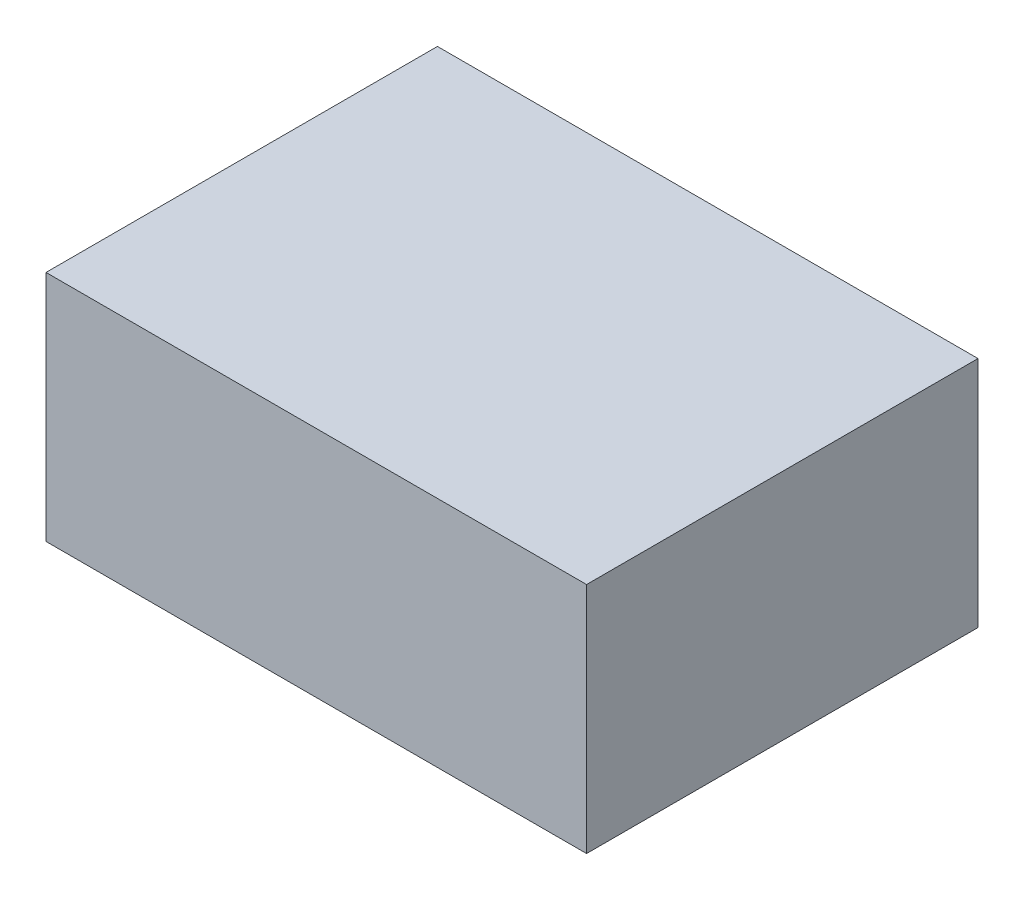
ISO-10303-21;
HEADER;
FILE_DESCRIPTION(('STEP AP214'),'2;1');
FILE_NAME('part.step','',(''),(''),'','','');
FILE_SCHEMA(('AUTOMOTIVE_DESIGN { 1 0 10303 214 1 1 1 1 }'));
ENDSEC;
DATA;
#1=APPLICATION_CONTEXT('core data for automotive mechanical design processes');
#2=APPLICATION_PROTOCOL_DEFINITION('international standard','automotive_design',2000,#1);
#3=PRODUCT_CONTEXT('',#1,'mechanical');
#4=PRODUCT('Part','Part','',(#3));
#5=PRODUCT_RELATED_PRODUCT_CATEGORY('part','',(#4));
#6=PRODUCT_DEFINITION_FORMATION('','',#4);
#7=PRODUCT_DEFINITION_CONTEXT('part definition',#1,'design');
#8=PRODUCT_DEFINITION('design','',#6,#7);
#9=PRODUCT_DEFINITION_SHAPE('','',#8);
#10=(LENGTH_UNIT() NAMED_UNIT(*) SI_UNIT(.MILLI.,.METRE.));
#11=(NAMED_UNIT(*) PLANE_ANGLE_UNIT() SI_UNIT($,.RADIAN.));
#12=(NAMED_UNIT(*) SI_UNIT($,.STERADIAN.) SOLID_ANGLE_UNIT());
#13=UNCERTAINTY_MEASURE_WITH_UNIT(LENGTH_MEASURE(1.E-05),#10,'distance_accuracy_value','');
#14=(GEOMETRIC_REPRESENTATION_CONTEXT(3) GLOBAL_UNCERTAINTY_ASSIGNED_CONTEXT((#13)) GLOBAL_UNIT_ASSIGNED_CONTEXT((#10,
#11,#12)) REPRESENTATION_CONTEXT('',''));
#15=CARTESIAN_POINT('',(0.,0.,0.));
#16=DIRECTION('',(0.,0.,1.));
#17=DIRECTION('',(1.,0.,0.));
#18=AXIS2_PLACEMENT_3D('',#15,#16,#17);
#19=CARTESIAN_POINT('',(0.,0.,21.));
#20=DIRECTION('',(1.,0.,0.));
#21=DIRECTION('',(0.,0.,-1.));
#22=AXIS2_PLACEMENT_3D('',#19,#20,#21);
#23=PLANE('',#22);
#24=DIRECTION('',(0.,-1.,0.));
#25=VECTOR('',#24,1.);
#26=CARTESIAN_POINT('',(0.,0.,0.));
#27=LINE('',#26,#25);
#28=CARTESIAN_POINT('',(0.,12.5,0.));
#29=VERTEX_POINT('',#28);
#30=CARTESIAN_POINT('',(0.,0.,0.));
#31=VERTEX_POINT('',#30);
#32=EDGE_CURVE('E96',#29,#31,#27,.T.);
#33=ORIENTED_EDGE('',*,*,#32,.T.);
#34=DIRECTION('',(0.,0.,-1.));
#35=VECTOR('',#34,1.);
#36=CARTESIAN_POINT('',(0.,0.,21.));
#37=LINE('',#36,#35);
#38=CARTESIAN_POINT('',(0.,0.,21.));
#39=VERTEX_POINT('',#38);
#40=EDGE_CURVE('E11',#39,#31,#37,.T.);
#41=ORIENTED_EDGE('',*,*,#40,.F.);
#42=DIRECTION('',(0.,-1.,0.));
#43=VECTOR('',#42,1.);
#44=CARTESIAN_POINT('',(0.,0.,21.));
#45=LINE('',#44,#43);
#46=CARTESIAN_POINT('',(0.,12.5,21.));
#47=VERTEX_POINT('',#46);
#48=EDGE_CURVE('E84',#47,#39,#45,.T.);
#49=ORIENTED_EDGE('',*,*,#48,.F.);
#50=DIRECTION('',(0.,0.,-1.));
#51=VECTOR('',#50,1.);
#52=CARTESIAN_POINT('',(0.,12.5,21.));
#53=LINE('',#52,#51);
#54=EDGE_CURVE('E92',#47,#29,#53,.T.);
#55=ORIENTED_EDGE('',*,*,#54,.T.);
#56=EDGE_LOOP('',(#33,#41,#49,#55));
#57=FACE_BOUND('',#56,.T.);
#58=ADVANCED_FACE('F33',(#57),#23,.F.);
#59=CARTESIAN_POINT('',(0.,0.,21.));
#60=DIRECTION('',(0.,1.,0.));
#61=DIRECTION('',(0.,0.,1.));
#62=AXIS2_PLACEMENT_3D('',#59,#60,#61);
#63=PLANE('',#62);
#64=DIRECTION('',(1.,0.,0.));
#65=VECTOR('',#64,1.);
#66=CARTESIAN_POINT('',(0.,0.,0.));
#67=LINE('',#66,#65);
#68=CARTESIAN_POINT('',(29.,0.,0.));
#69=VERTEX_POINT('',#68);
#70=EDGE_CURVE('E88',#31,#69,#67,.T.);
#71=ORIENTED_EDGE('',*,*,#70,.T.);
#72=DIRECTION('',(0.,0.,-1.));
#73=VECTOR('',#72,1.);
#74=CARTESIAN_POINT('',(29.,0.,21.));
#75=LINE('',#74,#73);
#76=CARTESIAN_POINT('',(29.,0.,21.));
#77=VERTEX_POINT('',#76);
#78=EDGE_CURVE('E41',#77,#69,#75,.T.);
#79=ORIENTED_EDGE('',*,*,#78,.F.);
#80=DIRECTION('',(1.,0.,0.));
#81=VECTOR('',#80,1.);
#82=CARTESIAN_POINT('',(0.,0.,21.));
#83=LINE('',#82,#81);
#84=EDGE_CURVE('E79',#39,#77,#83,.T.);
#85=ORIENTED_EDGE('',*,*,#84,.F.);
#86=ORIENTED_EDGE('',*,*,#40,.T.);
#87=EDGE_LOOP('',(#71,#79,#85,#86));
#88=FACE_BOUND('',#87,.T.);
#89=ADVANCED_FACE('F87',(#88),#63,.F.);
#90=CARTESIAN_POINT('',(29.,0.,21.));
#91=DIRECTION('',(-1.,0.,0.));
#92=DIRECTION('',(0.,0.,1.));
#93=AXIS2_PLACEMENT_3D('',#90,#91,#92);
#94=PLANE('',#93);
#95=DIRECTION('',(0.,1.,0.));
#96=VECTOR('',#95,1.);
#97=CARTESIAN_POINT('',(29.,0.,0.));
#98=LINE('',#97,#96);
#99=CARTESIAN_POINT('',(29.,12.5,0.));
#100=VERTEX_POINT('',#99);
#101=EDGE_CURVE('E66',#69,#100,#98,.T.);
#102=ORIENTED_EDGE('',*,*,#101,.T.);
#103=DIRECTION('',(0.,0.,-1.));
#104=VECTOR('',#103,1.);
#105=CARTESIAN_POINT('',(29.,12.5,21.));
#106=LINE('',#105,#104);
#107=CARTESIAN_POINT('',(29.,12.5,21.));
#108=VERTEX_POINT('',#107);
#109=EDGE_CURVE('E89',#108,#100,#106,.T.);
#110=ORIENTED_EDGE('',*,*,#109,.F.);
#111=DIRECTION('',(0.,1.,0.));
#112=VECTOR('',#111,1.);
#113=CARTESIAN_POINT('',(29.,0.,21.));
#114=LINE('',#113,#112);
#115=EDGE_CURVE('E82',#77,#108,#114,.T.);
#116=ORIENTED_EDGE('',*,*,#115,.F.);
#117=ORIENTED_EDGE('',*,*,#78,.T.);
#118=EDGE_LOOP('',(#102,#110,#116,#117));
#119=FACE_BOUND('',#118,.T.);
#120=ADVANCED_FACE('F90',(#119),#94,.F.);
#121=CARTESIAN_POINT('',(0.,12.5,21.));
#122=DIRECTION('',(0.,-1.,0.));
#123=DIRECTION('',(0.,0.,-1.));
#124=AXIS2_PLACEMENT_3D('',#121,#122,#123);
#125=PLANE('',#124);
#126=DIRECTION('',(-1.,0.,0.));
#127=VECTOR('',#126,1.);
#128=CARTESIAN_POINT('',(0.,12.5,0.));
#129=LINE('',#128,#127);
#130=EDGE_CURVE('E72',#100,#29,#129,.T.);
#131=ORIENTED_EDGE('',*,*,#130,.T.);
#132=ORIENTED_EDGE('',*,*,#54,.F.);
#133=DIRECTION('',(-1.,0.,0.));
#134=VECTOR('',#133,1.);
#135=CARTESIAN_POINT('',(0.,12.5,21.));
#136=LINE('',#135,#134);
#137=EDGE_CURVE('E49',#108,#47,#136,.T.);
#138=ORIENTED_EDGE('',*,*,#137,.F.);
#139=ORIENTED_EDGE('',*,*,#109,.T.);
#140=EDGE_LOOP('',(#131,#132,#138,#139));
#141=FACE_BOUND('',#140,.T.);
#142=ADVANCED_FACE('F103',(#141),#125,.F.);
#143=CARTESIAN_POINT('',(0.,0.,21.));
#144=DIRECTION('',(0.,0.,-1.));
#145=DIRECTION('',(-1.,0.,0.));
#146=AXIS2_PLACEMENT_3D('',#143,#144,#145);
#147=PLANE('',#146);
#148=ORIENTED_EDGE('',*,*,#48,.T.);
#149=ORIENTED_EDGE('',*,*,#84,.T.);
#150=ORIENTED_EDGE('',*,*,#115,.T.);
#151=ORIENTED_EDGE('',*,*,#137,.T.);
#152=EDGE_LOOP('',(#148,#149,#150,#151));
#153=FACE_BOUND('',#152,.T.);
#154=ADVANCED_FACE('F80',(#153),#147,.F.);
#155=CARTESIAN_POINT('',(0.,0.,0.));
#156=DIRECTION('',(0.,0.,-1.));
#157=DIRECTION('',(-1.,0.,0.));
#158=AXIS2_PLACEMENT_3D('',#155,#156,#157);
#159=PLANE('',#158);
#160=ORIENTED_EDGE('',*,*,#32,.F.);
#161=ORIENTED_EDGE('',*,*,#130,.F.);
#162=ORIENTED_EDGE('',*,*,#101,.F.);
#163=ORIENTED_EDGE('',*,*,#70,.F.);
#164=EDGE_LOOP('',(#160,#161,#162,#163));
#165=FACE_BOUND('',#164,.T.);
#166=ADVANCED_FACE('F106',(#165),#159,.T.);
#167=CLOSED_SHELL('',(#58,#89,#120,#142,#154,#166));
#168=MANIFOLD_SOLID_BREP('B2',#167);
#169=ADVANCED_BREP_SHAPE_REPRESENTATION('',(#18,#168),#14);
#170=SHAPE_DEFINITION_REPRESENTATION(#9,#169);
ENDSEC;
END-ISO-10303-21;
